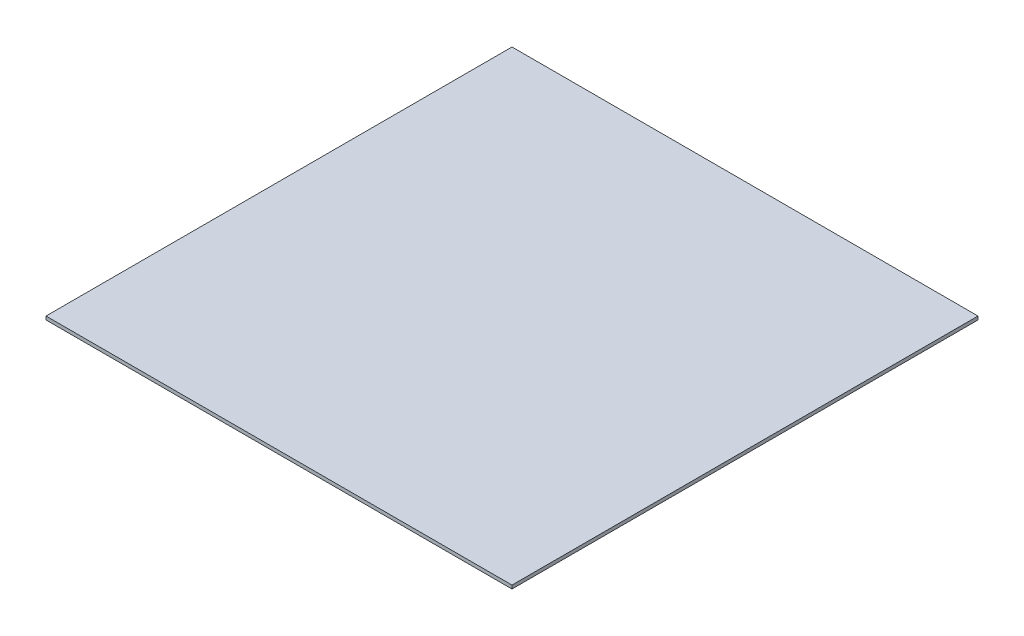
ISO-10303-21;
HEADER;
FILE_DESCRIPTION(('STEP AP214'),'2;1');
FILE_NAME('part.step','',(''),(''),'','','');
FILE_SCHEMA(('AUTOMOTIVE_DESIGN { 1 0 10303 214 1 1 1 1 }'));
ENDSEC;
DATA;
#1=APPLICATION_CONTEXT('core data for automotive mechanical design processes');
#2=APPLICATION_PROTOCOL_DEFINITION('international standard','automotive_design',2000,#1);
#3=PRODUCT_CONTEXT('',#1,'mechanical');
#4=PRODUCT('Part','Part','',(#3));
#5=PRODUCT_RELATED_PRODUCT_CATEGORY('part','',(#4));
#6=PRODUCT_DEFINITION_FORMATION('','',#4);
#7=PRODUCT_DEFINITION_CONTEXT('part definition',#1,'design');
#8=PRODUCT_DEFINITION('design','',#6,#7);
#9=PRODUCT_DEFINITION_SHAPE('','',#8);
#10=(LENGTH_UNIT() NAMED_UNIT(*) SI_UNIT(.MILLI.,.METRE.));
#11=(NAMED_UNIT(*) PLANE_ANGLE_UNIT() SI_UNIT($,.RADIAN.));
#12=(NAMED_UNIT(*) SI_UNIT($,.STERADIAN.) SOLID_ANGLE_UNIT());
#13=UNCERTAINTY_MEASURE_WITH_UNIT(LENGTH_MEASURE(1.E-05),#10,'distance_accuracy_value','');
#14=(GEOMETRIC_REPRESENTATION_CONTEXT(3) GLOBAL_UNCERTAINTY_ASSIGNED_CONTEXT((#13)) GLOBAL_UNIT_ASSIGNED_CONTEXT((#10,
#11,#12)) REPRESENTATION_CONTEXT('',''));
#15=CARTESIAN_POINT('',(0.,0.,0.));
#16=DIRECTION('',(0.,0.,1.));
#17=DIRECTION('',(1.,0.,0.));
#18=AXIS2_PLACEMENT_3D('',#15,#16,#17);
#19=CARTESIAN_POINT('',(-101.6,1.5,-101.6));
#20=DIRECTION('',(1.,0.,0.));
#21=DIRECTION('',(0.,0.,-1.));
#22=AXIS2_PLACEMENT_3D('',#19,#20,#21);
#23=PLANE('',#22);
#24=DIRECTION('',(0.,0.,1.));
#25=VECTOR('',#24,1.);
#26=CARTESIAN_POINT('',(-101.6,0.,-101.6));
#27=LINE('',#26,#25);
#28=CARTESIAN_POINT('',(-101.6,0.,-101.6));
#29=VERTEX_POINT('',#28);
#30=CARTESIAN_POINT('',(-101.6,0.,101.6));
#31=VERTEX_POINT('',#30);
#32=EDGE_CURVE('E112',#29,#31,#27,.T.);
#33=ORIENTED_EDGE('',*,*,#32,.T.);
#34=DIRECTION('',(0.,-1.,0.));
#35=VECTOR('',#34,1.);
#36=CARTESIAN_POINT('',(-101.6,1.5,101.6));
#37=LINE('',#36,#35);
#38=CARTESIAN_POINT('',(-101.6,1.5,101.6));
#39=VERTEX_POINT('',#38);
#40=EDGE_CURVE('E103',#39,#31,#37,.T.);
#41=ORIENTED_EDGE('',*,*,#40,.F.);
#42=DIRECTION('',(0.,0.,1.));
#43=VECTOR('',#42,1.);
#44=CARTESIAN_POINT('',(-101.6,1.5,-101.6));
#45=LINE('',#44,#43);
#46=CARTESIAN_POINT('',(-101.6,1.5,-101.6));
#47=VERTEX_POINT('',#46);
#48=EDGE_CURVE('E97',#47,#39,#45,.T.);
#49=ORIENTED_EDGE('',*,*,#48,.F.);
#50=DIRECTION('',(0.,-1.,0.));
#51=VECTOR('',#50,1.);
#52=CARTESIAN_POINT('',(-101.6,1.5,-101.6));
#53=LINE('',#52,#51);
#54=EDGE_CURVE('E108',#47,#29,#53,.T.);
#55=ORIENTED_EDGE('',*,*,#54,.T.);
#56=EDGE_LOOP('',(#33,#41,#49,#55));
#57=FACE_BOUND('',#56,.T.);
#58=ADVANCED_FACE('F43',(#57),#23,.F.);
#59=CARTESIAN_POINT('',(101.6,1.5,101.6));
#60=DIRECTION('',(0.,0.,-1.));
#61=DIRECTION('',(-1.,0.,0.));
#62=AXIS2_PLACEMENT_3D('',#59,#60,#61);
#63=PLANE('',#62);
#64=DIRECTION('',(1.,0.,0.));
#65=VECTOR('',#64,1.);
#66=CARTESIAN_POINT('',(101.6,0.,101.6));
#67=LINE('',#66,#65);
#68=CARTESIAN_POINT('',(101.6,0.,101.6));
#69=VERTEX_POINT('',#68);
#70=EDGE_CURVE('E102',#31,#69,#67,.T.);
#71=ORIENTED_EDGE('',*,*,#70,.T.);
#72=DIRECTION('',(0.,-1.,0.));
#73=VECTOR('',#72,1.);
#74=CARTESIAN_POINT('',(101.6,1.5,101.6));
#75=LINE('',#74,#73);
#76=CARTESIAN_POINT('',(101.6,1.5,101.6));
#77=VERTEX_POINT('',#76);
#78=EDGE_CURVE('E100',#77,#69,#75,.T.);
#79=ORIENTED_EDGE('',*,*,#78,.F.);
#80=DIRECTION('',(1.,0.,0.));
#81=VECTOR('',#80,1.);
#82=CARTESIAN_POINT('',(101.6,1.5,101.6));
#83=LINE('',#82,#81);
#84=EDGE_CURVE('E92',#39,#77,#83,.T.);
#85=ORIENTED_EDGE('',*,*,#84,.F.);
#86=ORIENTED_EDGE('',*,*,#40,.T.);
#87=EDGE_LOOP('',(#71,#79,#85,#86));
#88=FACE_BOUND('',#87,.T.);
#89=ADVANCED_FACE('F101',(#88),#63,.F.);
#90=CARTESIAN_POINT('',(101.6,1.5,-101.6));
#91=DIRECTION('',(-1.,0.,0.));
#92=DIRECTION('',(0.,0.,1.));
#93=AXIS2_PLACEMENT_3D('',#90,#91,#92);
#94=PLANE('',#93);
#95=DIRECTION('',(0.,0.,-1.));
#96=VECTOR('',#95,1.);
#97=CARTESIAN_POINT('',(101.6,0.,-101.6));
#98=LINE('',#97,#96);
#99=CARTESIAN_POINT('',(101.6,0.,-101.6));
#100=VERTEX_POINT('',#99);
#101=EDGE_CURVE('E78',#69,#100,#98,.T.);
#102=ORIENTED_EDGE('',*,*,#101,.T.);
#103=DIRECTION('',(0.,-1.,0.));
#104=VECTOR('',#103,1.);
#105=CARTESIAN_POINT('',(101.6,1.5,-101.6));
#106=LINE('',#105,#104);
#107=CARTESIAN_POINT('',(101.6,1.5,-101.6));
#108=VERTEX_POINT('',#107);
#109=EDGE_CURVE('E104',#108,#100,#106,.T.);
#110=ORIENTED_EDGE('',*,*,#109,.F.);
#111=DIRECTION('',(0.,0.,-1.));
#112=VECTOR('',#111,1.);
#113=CARTESIAN_POINT('',(101.6,1.5,-101.6));
#114=LINE('',#113,#112);
#115=EDGE_CURVE('E95',#77,#108,#114,.T.);
#116=ORIENTED_EDGE('',*,*,#115,.F.);
#117=ORIENTED_EDGE('',*,*,#78,.T.);
#118=EDGE_LOOP('',(#102,#110,#116,#117));
#119=FACE_BOUND('',#118,.T.);
#120=ADVANCED_FACE('F106',(#119),#94,.F.);
#121=CARTESIAN_POINT('',(101.6,1.5,-101.6));
#122=DIRECTION('',(0.,0.,1.));
#123=DIRECTION('',(1.,0.,0.));
#124=AXIS2_PLACEMENT_3D('',#121,#122,#123);
#125=PLANE('',#124);
#126=DIRECTION('',(-1.,0.,0.));
#127=VECTOR('',#126,1.);
#128=CARTESIAN_POINT('',(101.6,0.,-101.6));
#129=LINE('',#128,#127);
#130=EDGE_CURVE('E84',#100,#29,#129,.T.);
#131=ORIENTED_EDGE('',*,*,#130,.T.);
#132=ORIENTED_EDGE('',*,*,#54,.F.);
#133=DIRECTION('',(-1.,0.,0.));
#134=VECTOR('',#133,1.);
#135=CARTESIAN_POINT('',(101.6,1.5,-101.6));
#136=LINE('',#135,#134);
#137=EDGE_CURVE('E61',#108,#47,#136,.T.);
#138=ORIENTED_EDGE('',*,*,#137,.F.);
#139=ORIENTED_EDGE('',*,*,#109,.T.);
#140=EDGE_LOOP('',(#131,#132,#138,#139));
#141=FACE_BOUND('',#140,.T.);
#142=ADVANCED_FACE('F146',(#141),#125,.F.);
#143=CARTESIAN_POINT('',(0.,1.5,0.));
#144=DIRECTION('',(0.,-1.,0.));
#145=DIRECTION('',(0.,0.,-1.));
#146=AXIS2_PLACEMENT_3D('',#143,#144,#145);
#147=PLANE('',#146);
#148=ORIENTED_EDGE('',*,*,#48,.T.);
#149=ORIENTED_EDGE('',*,*,#84,.T.);
#150=ORIENTED_EDGE('',*,*,#115,.T.);
#151=ORIENTED_EDGE('',*,*,#137,.T.);
#152=EDGE_LOOP('',(#148,#149,#150,#151));
#153=FACE_BOUND('',#152,.T.);
#154=ADVANCED_FACE('F93',(#153),#147,.F.);
#155=CARTESIAN_POINT('',(0.,0.,0.));
#156=DIRECTION('',(0.,-1.,0.));
#157=DIRECTION('',(0.,0.,-1.));
#158=AXIS2_PLACEMENT_3D('',#155,#156,#157);
#159=PLANE('',#158);
#160=CARTESIAN_POINT('',(0.,0.,0.));
#161=DIRECTION('',(0.,-1.,0.));
#162=DIRECTION('',(0.,0.,-1.));
#163=AXIS2_PLACEMENT_3D('',#160,#161,#162);
#164=CIRCLE('',#163,10.);
#165=CARTESIAN_POINT('',(0.,0.,-10.));
#166=VERTEX_POINT('',#165);
#167=EDGE_CURVE('E11',#166,#166,#164,.T.);
#168=ORIENTED_EDGE('',*,*,#167,.F.);
#169=EDGE_LOOP('',(#168));
#170=FACE_BOUND('',#169,.T.);
#171=ORIENTED_EDGE('',*,*,#32,.F.);
#172=ORIENTED_EDGE('',*,*,#130,.F.);
#173=ORIENTED_EDGE('',*,*,#101,.F.);
#174=ORIENTED_EDGE('',*,*,#70,.F.);
#175=EDGE_LOOP('',(#171,#172,#173,#174));
#176=FACE_BOUND('',#175,.T.);
#177=ADVANCED_FACE('F149',(#170,#176),#159,.T.);
#178=CARTESIAN_POINT('',(0.,-1.,0.));
#179=DIRECTION('',(0.,1.,0.));
#180=DIRECTION('',(0.,0.,1.));
#181=AXIS2_PLACEMENT_3D('',#178,#179,#180);
#182=CYLINDRICAL_SURFACE('',#181,10.);
#183=CARTESIAN_POINT('',(0.,-1.,0.));
#184=DIRECTION('',(0.,1.,0.));
#185=DIRECTION('',(0.,0.,1.));
#186=AXIS2_PLACEMENT_3D('',#183,#184,#185);
#187=CIRCLE('',#186,10.);
#188=CARTESIAN_POINT('',(0.,-1.,10.));
#189=VERTEX_POINT('',#188);
#190=EDGE_CURVE('E162',#189,#189,#187,.T.);
#191=ORIENTED_EDGE('',*,*,#190,.T.);
#192=EDGE_LOOP('',(#191));
#193=FACE_BOUND('',#192,.T.);
#194=ORIENTED_EDGE('',*,*,#167,.T.);
#195=EDGE_LOOP('',(#194));
#196=FACE_BOUND('',#195,.T.);
#197=ADVANCED_FACE('F133',(#193,#196),#182,.T.);
#198=CARTESIAN_POINT('',(0.,-1.,0.));
#199=DIRECTION('',(0.,1.,0.));
#200=DIRECTION('',(0.,0.,1.));
#201=AXIS2_PLACEMENT_3D('',#198,#199,#200);
#202=PLANE('',#201);
#203=CARTESIAN_POINT('',(0.,-1.,0.));
#204=DIRECTION('',(0.,1.,0.));
#205=DIRECTION('',(0.,0.,1.));
#206=AXIS2_PLACEMENT_3D('',#203,#204,#205);
#207=CIRCLE('',#206,2.1);
#208=CARTESIAN_POINT('',(0.,-1.,2.1));
#209=VERTEX_POINT('',#208);
#210=EDGE_CURVE('E47',#209,#209,#207,.F.);
#211=ORIENTED_EDGE('',*,*,#210,.F.);
#212=EDGE_LOOP('',(#211));
#213=FACE_BOUND('',#212,.T.);
#214=ORIENTED_EDGE('',*,*,#190,.F.);
#215=EDGE_LOOP('',(#214));
#216=FACE_BOUND('',#215,.T.);
#217=ADVANCED_FACE('F128',(#213,#216),#202,.F.);
#218=CARTESIAN_POINT('',(0.,-25.,0.));
#219=DIRECTION('',(0.,1.,0.));
#220=DIRECTION('',(0.,0.,1.));
#221=AXIS2_PLACEMENT_3D('',#218,#219,#220);
#222=PLANE('',#221);
#223=CARTESIAN_POINT('',(0.,-25.,0.));
#224=DIRECTION('',(0.,1.,0.));
#225=DIRECTION('',(0.,0.,1.));
#226=AXIS2_PLACEMENT_3D('',#223,#224,#225);
#227=CIRCLE('',#226,2.1);
#228=CARTESIAN_POINT('',(0.,-25.,2.1));
#229=VERTEX_POINT('',#228);
#230=EDGE_CURVE('E53',#229,#229,#227,.T.);
#231=ORIENTED_EDGE('',*,*,#230,.F.);
#232=EDGE_LOOP('',(#231));
#233=FACE_BOUND('',#232,.T.);
#234=ADVANCED_FACE('F126',(#233),#222,.F.);
#235=CARTESIAN_POINT('',(0.,-25.,0.));
#236=DIRECTION('',(0.,1.,0.));
#237=DIRECTION('',(0.,0.,1.));
#238=AXIS2_PLACEMENT_3D('',#235,#236,#237);
#239=CYLINDRICAL_SURFACE('',#238,2.1);
#240=ORIENTED_EDGE('',*,*,#230,.T.);
#241=EDGE_LOOP('',(#240));
#242=FACE_BOUND('',#241,.T.);
#243=ORIENTED_EDGE('',*,*,#210,.T.);
#244=EDGE_LOOP('',(#243));
#245=FACE_BOUND('',#244,.T.);
#246=ADVANCED_FACE('F45',(#242,#245),#239,.T.);
#247=CLOSED_SHELL('',(#58,#89,#120,#142,#154,#177,#197,#217,#234,#246));
#248=MANIFOLD_SOLID_BREP('B2',#247);
#249=ADVANCED_BREP_SHAPE_REPRESENTATION('',(#18,#248),#14);
#250=SHAPE_DEFINITION_REPRESENTATION(#9,#249);
ENDSEC;
END-ISO-10303-21;
